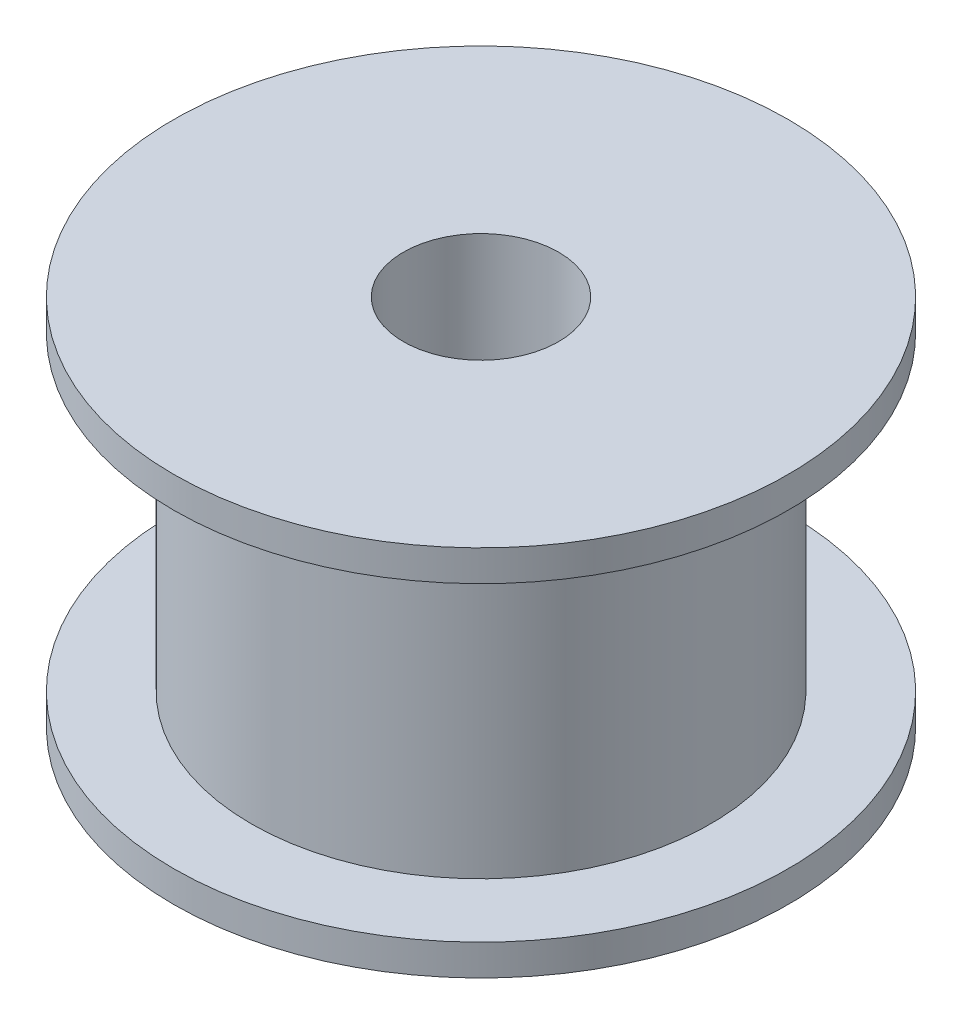
ISO-10303-21;
HEADER;
FILE_DESCRIPTION(('STEP AP214'),'2;1');
FILE_NAME('part.step','',(''),(''),'','','');
FILE_SCHEMA(('AUTOMOTIVE_DESIGN { 1 0 10303 214 1 1 1 1 }'));
ENDSEC;
DATA;
#1=APPLICATION_CONTEXT('core data for automotive mechanical design processes');
#2=APPLICATION_PROTOCOL_DEFINITION('international standard','automotive_design',2000,#1);
#3=PRODUCT_CONTEXT('',#1,'mechanical');
#4=PRODUCT('Part','Part','',(#3));
#5=PRODUCT_RELATED_PRODUCT_CATEGORY('part','',(#4));
#6=PRODUCT_DEFINITION_FORMATION('','',#4);
#7=PRODUCT_DEFINITION_CONTEXT('part definition',#1,'design');
#8=PRODUCT_DEFINITION('design','',#6,#7);
#9=PRODUCT_DEFINITION_SHAPE('','',#8);
#10=(LENGTH_UNIT() NAMED_UNIT(*) SI_UNIT(.MILLI.,.METRE.));
#11=(NAMED_UNIT(*) PLANE_ANGLE_UNIT() SI_UNIT($,.RADIAN.));
#12=(NAMED_UNIT(*) SI_UNIT($,.STERADIAN.) SOLID_ANGLE_UNIT());
#13=UNCERTAINTY_MEASURE_WITH_UNIT(LENGTH_MEASURE(1.E-05),#10,'distance_accuracy_value','');
#14=(GEOMETRIC_REPRESENTATION_CONTEXT(3) GLOBAL_UNCERTAINTY_ASSIGNED_CONTEXT((#13)) GLOBAL_UNIT_ASSIGNED_CONTEXT((#10,
#11,#12)) REPRESENTATION_CONTEXT('',''));
#15=CARTESIAN_POINT('',(0.,0.,0.));
#16=DIRECTION('',(0.,0.,1.));
#17=DIRECTION('',(1.,0.,0.));
#18=AXIS2_PLACEMENT_3D('',#15,#16,#17);
#19=CARTESIAN_POINT('',(0.,6.,0.));
#20=DIRECTION('',(0.,1.,0.));
#21=DIRECTION('',(0.,0.,1.));
#22=AXIS2_PLACEMENT_3D('',#19,#20,#21);
#23=PLANE('',#22);
#24=CARTESIAN_POINT('',(0.,6.,0.));
#25=DIRECTION('',(0.,-1.,0.));
#26=DIRECTION('',(0.,0.,-1.));
#27=AXIS2_PLACEMENT_3D('',#24,#25,#26);
#28=CIRCLE('',#27,2.5);
#29=CARTESIAN_POINT('',(0.,6.,-2.5));
#30=VERTEX_POINT('',#29);
#31=EDGE_CURVE('E10',#30,#30,#28,.T.);
#32=ORIENTED_EDGE('',*,*,#31,.T.);
#33=EDGE_LOOP('',(#32));
#34=FACE_BOUND('',#33,.T.);
#35=CARTESIAN_POINT('',(0.,6.,0.));
#36=DIRECTION('',(0.,-1.,0.));
#37=DIRECTION('',(0.,0.,-1.));
#38=AXIS2_PLACEMENT_3D('',#35,#36,#37);
#39=CIRCLE('',#38,9.9);
#40=CARTESIAN_POINT('',(0.,6.,-9.9));
#41=VERTEX_POINT('',#40);
#42=EDGE_CURVE('E72',#41,#41,#39,.T.);
#43=ORIENTED_EDGE('',*,*,#42,.F.);
#44=EDGE_LOOP('',(#43));
#45=FACE_BOUND('',#44,.T.);
#46=ADVANCED_FACE('F37',(#34,#45),#23,.T.);
#47=CARTESIAN_POINT('',(0.,-6.,0.));
#48=DIRECTION('',(0.,-1.,0.));
#49=DIRECTION('',(0.,0.,-1.));
#50=AXIS2_PLACEMENT_3D('',#47,#48,#49);
#51=CYLINDRICAL_SURFACE('',#50,2.5);
#52=CARTESIAN_POINT('',(0.,-6.,0.));
#53=DIRECTION('',(0.,-1.,0.));
#54=DIRECTION('',(0.,0.,-1.));
#55=AXIS2_PLACEMENT_3D('',#52,#53,#54);
#56=CIRCLE('',#55,2.5);
#57=CARTESIAN_POINT('',(0.,-6.,-2.5));
#58=VERTEX_POINT('',#57);
#59=EDGE_CURVE('E44',#58,#58,#56,.T.);
#60=ORIENTED_EDGE('',*,*,#59,.T.);
#61=EDGE_LOOP('',(#60));
#62=FACE_BOUND('',#61,.T.);
#63=ORIENTED_EDGE('',*,*,#31,.F.);
#64=EDGE_LOOP('',(#63));
#65=FACE_BOUND('',#64,.T.);
#66=ADVANCED_FACE('F81',(#62,#65),#51,.F.);
#67=CARTESIAN_POINT('',(0.,-6.,0.));
#68=DIRECTION('',(0.,1.,0.));
#69=DIRECTION('',(0.,0.,1.));
#70=AXIS2_PLACEMENT_3D('',#67,#68,#69);
#71=PLANE('',#70);
#72=ORIENTED_EDGE('',*,*,#59,.F.);
#73=EDGE_LOOP('',(#72));
#74=FACE_BOUND('',#73,.T.);
#75=CARTESIAN_POINT('',(0.,-6.,0.));
#76=DIRECTION('',(0.,-1.,0.));
#77=DIRECTION('',(0.,0.,-1.));
#78=AXIS2_PLACEMENT_3D('',#75,#76,#77);
#79=CIRCLE('',#78,9.9);
#80=CARTESIAN_POINT('',(0.,-6.,-9.9));
#81=VERTEX_POINT('',#80);
#82=EDGE_CURVE('E49',#81,#81,#79,.T.);
#83=ORIENTED_EDGE('',*,*,#82,.T.);
#84=EDGE_LOOP('',(#83));
#85=FACE_BOUND('',#84,.T.);
#86=ADVANCED_FACE('F85',(#74,#85),#71,.F.);
#87=CARTESIAN_POINT('',(0.,-6.,0.));
#88=DIRECTION('',(0.,-1.,0.));
#89=DIRECTION('',(0.,0.,-1.));
#90=AXIS2_PLACEMENT_3D('',#87,#88,#89);
#91=CYLINDRICAL_SURFACE('',#90,9.9);
#92=CARTESIAN_POINT('',(0.,-5.,0.));
#93=DIRECTION('',(0.,-1.,0.));
#94=DIRECTION('',(0.,0.,-1.));
#95=AXIS2_PLACEMENT_3D('',#92,#93,#94);
#96=CIRCLE('',#95,9.9);
#97=CARTESIAN_POINT('',(0.,-5.,-9.9));
#98=VERTEX_POINT('',#97);
#99=EDGE_CURVE('E54',#98,#98,#96,.T.);
#100=ORIENTED_EDGE('',*,*,#99,.T.);
#101=EDGE_LOOP('',(#100));
#102=FACE_BOUND('',#101,.T.);
#103=ORIENTED_EDGE('',*,*,#82,.F.);
#104=EDGE_LOOP('',(#103));
#105=FACE_BOUND('',#104,.T.);
#106=ADVANCED_FACE('F89',(#102,#105),#91,.T.);
#107=CARTESIAN_POINT('',(0.,-5.,0.));
#108=DIRECTION('',(0.,1.,0.));
#109=DIRECTION('',(0.,0.,1.));
#110=AXIS2_PLACEMENT_3D('',#107,#108,#109);
#111=PLANE('',#110);
#112=CARTESIAN_POINT('',(0.,-5.,0.));
#113=DIRECTION('',(0.,-1.,0.));
#114=DIRECTION('',(0.,0.,-1.));
#115=AXIS2_PLACEMENT_3D('',#112,#113,#114);
#116=CIRCLE('',#115,7.4);
#117=CARTESIAN_POINT('',(0.,-5.,-7.4));
#118=VERTEX_POINT('',#117);
#119=EDGE_CURVE('E60',#118,#118,#116,.T.);
#120=ORIENTED_EDGE('',*,*,#119,.T.);
#121=EDGE_LOOP('',(#120));
#122=FACE_BOUND('',#121,.T.);
#123=ORIENTED_EDGE('',*,*,#99,.F.);
#124=EDGE_LOOP('',(#123));
#125=FACE_BOUND('',#124,.T.);
#126=ADVANCED_FACE('F96',(#122,#125),#111,.T.);
#127=CARTESIAN_POINT('',(0.,-6.,0.));
#128=DIRECTION('',(0.,-1.,0.));
#129=DIRECTION('',(0.,0.,-1.));
#130=AXIS2_PLACEMENT_3D('',#127,#128,#129);
#131=CYLINDRICAL_SURFACE('',#130,7.4);
#132=CARTESIAN_POINT('',(0.,5.,0.));
#133=DIRECTION('',(0.,-1.,0.));
#134=DIRECTION('',(0.,0.,-1.));
#135=AXIS2_PLACEMENT_3D('',#132,#133,#134);
#136=CIRCLE('',#135,7.4);
#137=CARTESIAN_POINT('',(0.,5.,-7.4));
#138=VERTEX_POINT('',#137);
#139=EDGE_CURVE('E64',#138,#138,#136,.T.);
#140=ORIENTED_EDGE('',*,*,#139,.T.);
#141=EDGE_LOOP('',(#140));
#142=FACE_BOUND('',#141,.T.);
#143=ORIENTED_EDGE('',*,*,#119,.F.);
#144=EDGE_LOOP('',(#143));
#145=FACE_BOUND('',#144,.T.);
#146=ADVANCED_FACE('F100',(#142,#145),#131,.T.);
#147=CARTESIAN_POINT('',(0.,5.,0.));
#148=DIRECTION('',(0.,1.,0.));
#149=DIRECTION('',(0.,0.,1.));
#150=AXIS2_PLACEMENT_3D('',#147,#148,#149);
#151=PLANE('',#150);
#152=ORIENTED_EDGE('',*,*,#139,.F.);
#153=EDGE_LOOP('',(#152));
#154=FACE_BOUND('',#153,.T.);
#155=CARTESIAN_POINT('',(0.,5.,0.));
#156=DIRECTION('',(0.,-1.,0.));
#157=DIRECTION('',(0.,0.,-1.));
#158=AXIS2_PLACEMENT_3D('',#155,#156,#157);
#159=CIRCLE('',#158,9.9);
#160=CARTESIAN_POINT('',(0.,5.,-9.9));
#161=VERTEX_POINT('',#160);
#162=EDGE_CURVE('E68',#161,#161,#159,.T.);
#163=ORIENTED_EDGE('',*,*,#162,.T.);
#164=EDGE_LOOP('',(#163));
#165=FACE_BOUND('',#164,.T.);
#166=ADVANCED_FACE('F104',(#154,#165),#151,.F.);
#167=CARTESIAN_POINT('',(0.,-6.,0.));
#168=DIRECTION('',(0.,-1.,0.));
#169=DIRECTION('',(0.,0.,-1.));
#170=AXIS2_PLACEMENT_3D('',#167,#168,#169);
#171=CYLINDRICAL_SURFACE('',#170,9.9);
#172=ORIENTED_EDGE('',*,*,#42,.T.);
#173=EDGE_LOOP('',(#172));
#174=FACE_BOUND('',#173,.T.);
#175=ORIENTED_EDGE('',*,*,#162,.F.);
#176=EDGE_LOOP('',(#175));
#177=FACE_BOUND('',#176,.T.);
#178=ADVANCED_FACE('F77',(#174,#177),#171,.T.);
#179=CLOSED_SHELL('',(#46,#66,#86,#106,#126,#146,#166,#178));
#180=MANIFOLD_SOLID_BREP('B2',#179);
#181=ADVANCED_BREP_SHAPE_REPRESENTATION('',(#18,#180),#14);
#182=SHAPE_DEFINITION_REPRESENTATION(#9,#181);
ENDSEC;
END-ISO-10303-21;
